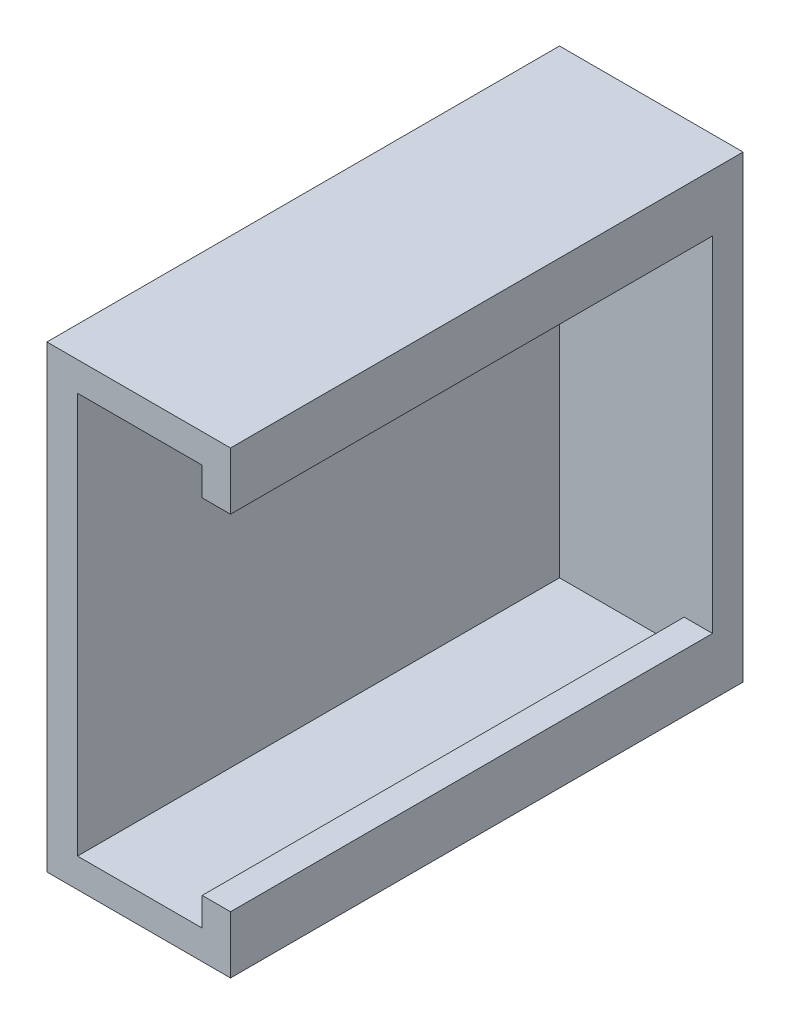
ISO-10303-21;
HEADER;
FILE_DESCRIPTION(('STEP AP214'),'2;1');
FILE_NAME('part.step','',(''),(''),'','','');
FILE_SCHEMA(('AUTOMOTIVE_DESIGN { 1 0 10303 214 1 1 1 1 }'));
ENDSEC;
DATA;
#1=APPLICATION_CONTEXT('core data for automotive mechanical design processes');
#2=APPLICATION_PROTOCOL_DEFINITION('international standard','automotive_design',2000,#1);
#3=PRODUCT_CONTEXT('',#1,'mechanical');
#4=PRODUCT('Part','Part','',(#3));
#5=PRODUCT_RELATED_PRODUCT_CATEGORY('part','',(#4));
#6=PRODUCT_DEFINITION_FORMATION('','',#4);
#7=PRODUCT_DEFINITION_CONTEXT('part definition',#1,'design');
#8=PRODUCT_DEFINITION('design','',#6,#7);
#9=PRODUCT_DEFINITION_SHAPE('','',#8);
#10=(LENGTH_UNIT() NAMED_UNIT(*) SI_UNIT(.MILLI.,.METRE.));
#11=(NAMED_UNIT(*) PLANE_ANGLE_UNIT() SI_UNIT($,.RADIAN.));
#12=(NAMED_UNIT(*) SI_UNIT($,.STERADIAN.) SOLID_ANGLE_UNIT());
#13=UNCERTAINTY_MEASURE_WITH_UNIT(LENGTH_MEASURE(1.E-05),#10,'distance_accuracy_value','');
#14=(GEOMETRIC_REPRESENTATION_CONTEXT(3) GLOBAL_UNCERTAINTY_ASSIGNED_CONTEXT((#13)) GLOBAL_UNIT_ASSIGNED_CONTEXT((#10,
#11,#12)) REPRESENTATION_CONTEXT('',''));
#15=CARTESIAN_POINT('',(0.,0.,0.));
#16=DIRECTION('',(0.,0.,1.));
#17=DIRECTION('',(1.,0.,0.));
#18=AXIS2_PLACEMENT_3D('',#15,#16,#17);
#19=CARTESIAN_POINT('',(0.,0.,4.));
#20=DIRECTION('',(0.,0.,-1.));
#21=DIRECTION('',(-1.,0.,0.));
#22=AXIS2_PLACEMENT_3D('',#19,#20,#21);
#23=PLANE('',#22);
#24=DIRECTION('',(1.,0.,0.));
#25=VECTOR('',#24,1.);
#26=CARTESIAN_POINT('',(24.,52.5,4.));
#27=LINE('',#26,#25);
#28=CARTESIAN_POINT('',(20.3,52.5,4.));
#29=VERTEX_POINT('',#28);
#30=CARTESIAN_POINT('',(24.,52.5,4.));
#31=VERTEX_POINT('',#30);
#32=EDGE_CURVE('E52',#29,#31,#27,.T.);
#33=ORIENTED_EDGE('',*,*,#32,.F.);
#34=DIRECTION('',(0.,-1.,0.));
#35=VECTOR('',#34,1.);
#36=CARTESIAN_POINT('',(20.3,52.5,4.));
#37=LINE('',#36,#35);
#38=CARTESIAN_POINT('',(20.3,56.2,4.));
#39=VERTEX_POINT('',#38);
#40=EDGE_CURVE('E56',#39,#29,#37,.T.);
#41=ORIENTED_EDGE('',*,*,#40,.F.);
#42=DIRECTION('',(1.,0.,0.));
#43=VECTOR('',#42,1.);
#44=CARTESIAN_POINT('',(20.3,56.2,4.));
#45=LINE('',#44,#43);
#46=CARTESIAN_POINT('',(4.,56.2,4.));
#47=VERTEX_POINT('',#46);
#48=EDGE_CURVE('E185',#47,#39,#45,.T.);
#49=ORIENTED_EDGE('',*,*,#48,.F.);
#50=DIRECTION('',(0.,1.,0.));
#51=VECTOR('',#50,1.);
#52=CARTESIAN_POINT('',(4.,56.2,4.));
#53=LINE('',#52,#51);
#54=CARTESIAN_POINT('',(4.00000000000001,3.8,4.));
#55=VERTEX_POINT('',#54);
#56=EDGE_CURVE('E182',#55,#47,#53,.T.);
#57=ORIENTED_EDGE('',*,*,#56,.F.);
#58=DIRECTION('',(-1.,0.,0.));
#59=VECTOR('',#58,1.);
#60=CARTESIAN_POINT('',(4.00000000000001,3.8,4.));
#61=LINE('',#60,#59);
#62=CARTESIAN_POINT('',(20.3,3.8,4.));
#63=VERTEX_POINT('',#62);
#64=EDGE_CURVE('E179',#63,#55,#61,.T.);
#65=ORIENTED_EDGE('',*,*,#64,.F.);
#66=DIRECTION('',(0.,-1.,0.));
#67=VECTOR('',#66,1.);
#68=CARTESIAN_POINT('',(20.3,3.8,4.));
#69=LINE('',#68,#67);
#70=CARTESIAN_POINT('',(20.3,7.5,4.));
#71=VERTEX_POINT('',#70);
#72=EDGE_CURVE('E176',#71,#63,#69,.T.);
#73=ORIENTED_EDGE('',*,*,#72,.F.);
#74=DIRECTION('',(-1.,0.,0.));
#75=VECTOR('',#74,1.);
#76=CARTESIAN_POINT('',(20.3,7.5,4.));
#77=LINE('',#76,#75);
#78=CARTESIAN_POINT('',(24.,7.5,4.));
#79=VERTEX_POINT('',#78);
#80=EDGE_CURVE('E173',#79,#71,#77,.T.);
#81=ORIENTED_EDGE('',*,*,#80,.F.);
#82=DIRECTION('',(0.,1.,0.));
#83=VECTOR('',#82,1.);
#84=CARTESIAN_POINT('',(24.,0.,4.));
#85=LINE('',#84,#83);
#86=EDGE_CURVE('E211',#79,#31,#85,.T.);
#87=ORIENTED_EDGE('',*,*,#86,.T.);
#88=EDGE_LOOP('',(#33,#41,#49,#57,#65,#73,#81,#87));
#89=FACE_BOUND('',#88,.T.);
#90=ADVANCED_FACE('F37',(#89),#23,.F.);
#91=CARTESIAN_POINT('',(0.,0.,4.));
#92=DIRECTION('',(1.,0.,0.));
#93=DIRECTION('',(0.,0.,-1.));
#94=AXIS2_PLACEMENT_3D('',#91,#92,#93);
#95=PLANE('',#94);
#96=DIRECTION('',(0.,-1.,0.));
#97=VECTOR('',#96,1.);
#98=CARTESIAN_POINT('',(0.,0.,0.));
#99=LINE('',#98,#97);
#100=CARTESIAN_POINT('',(0.,60.,0.));
#101=VERTEX_POINT('',#100);
#102=CARTESIAN_POINT('',(0.,0.,0.));
#103=VERTEX_POINT('',#102);
#104=EDGE_CURVE('E210',#101,#103,#99,.T.);
#105=ORIENTED_EDGE('',*,*,#104,.T.);
#106=DIRECTION('',(0.,0.,-1.));
#107=VECTOR('',#106,1.);
#108=CARTESIAN_POINT('',(0.,0.,4.));
#109=LINE('',#108,#107);
#110=CARTESIAN_POINT('',(0.,0.,67.));
#111=VERTEX_POINT('',#110);
#112=EDGE_CURVE('E11',#111,#103,#109,.T.);
#113=ORIENTED_EDGE('',*,*,#112,.F.);
#114=DIRECTION('',(0.,-1.,0.));
#115=VECTOR('',#114,1.);
#116=CARTESIAN_POINT('',(0.,0.,67.));
#117=LINE('',#116,#115);
#118=CARTESIAN_POINT('',(0.,60.,67.));
#119=VERTEX_POINT('',#118);
#120=EDGE_CURVE('E144',#119,#111,#117,.T.);
#121=ORIENTED_EDGE('',*,*,#120,.F.);
#122=DIRECTION('',(0.,0.,-1.));
#123=VECTOR('',#122,1.);
#124=CARTESIAN_POINT('',(0.,60.,4.));
#125=LINE('',#124,#123);
#126=EDGE_CURVE('E135',#119,#101,#125,.T.);
#127=ORIENTED_EDGE('',*,*,#126,.T.);
#128=EDGE_LOOP('',(#105,#113,#121,#127));
#129=FACE_BOUND('',#128,.T.);
#130=ADVANCED_FACE('F39',(#129),#95,.F.);
#131=CARTESIAN_POINT('',(0.,0.,4.));
#132=DIRECTION('',(0.,1.,0.));
#133=DIRECTION('',(0.,0.,1.));
#134=AXIS2_PLACEMENT_3D('',#131,#132,#133);
#135=PLANE('',#134);
#136=DIRECTION('',(1.,0.,0.));
#137=VECTOR('',#136,1.);
#138=CARTESIAN_POINT('',(0.,0.,0.));
#139=LINE('',#138,#137);
#140=CARTESIAN_POINT('',(24.,0.,0.));
#141=VERTEX_POINT('',#140);
#142=EDGE_CURVE('E216',#103,#141,#139,.T.);
#143=ORIENTED_EDGE('',*,*,#142,.T.);
#144=DIRECTION('',(0.,0.,-1.));
#145=VECTOR('',#144,1.);
#146=CARTESIAN_POINT('',(24.,0.,4.));
#147=LINE('',#146,#145);
#148=CARTESIAN_POINT('',(24.,0.,67.));
#149=VERTEX_POINT('',#148);
#150=EDGE_CURVE('E45',#149,#141,#147,.T.);
#151=ORIENTED_EDGE('',*,*,#150,.F.);
#152=DIRECTION('',(1.,0.,0.));
#153=VECTOR('',#152,1.);
#154=CARTESIAN_POINT('',(24.,0.,67.));
#155=LINE('',#154,#153);
#156=EDGE_CURVE('E154',#111,#149,#155,.T.);
#157=ORIENTED_EDGE('',*,*,#156,.F.);
#158=ORIENTED_EDGE('',*,*,#112,.T.);
#159=EDGE_LOOP('',(#143,#151,#157,#158));
#160=FACE_BOUND('',#159,.T.);
#161=ADVANCED_FACE('F228',(#160),#135,.F.);
#162=CARTESIAN_POINT('',(24.,0.,4.));
#163=DIRECTION('',(-1.,0.,0.));
#164=DIRECTION('',(0.,0.,1.));
#165=AXIS2_PLACEMENT_3D('',#162,#163,#164);
#166=PLANE('',#165);
#167=DIRECTION('',(0.,1.,0.));
#168=VECTOR('',#167,1.);
#169=CARTESIAN_POINT('',(24.,0.,0.));
#170=LINE('',#169,#168);
#171=CARTESIAN_POINT('',(24.,60.,0.));
#172=VERTEX_POINT('',#171);
#173=EDGE_CURVE('E132',#141,#172,#170,.T.);
#174=ORIENTED_EDGE('',*,*,#173,.T.);
#175=DIRECTION('',(0.,0.,-1.));
#176=VECTOR('',#175,1.);
#177=CARTESIAN_POINT('',(24.,60.,4.));
#178=LINE('',#177,#176);
#179=CARTESIAN_POINT('',(24.,60.,67.));
#180=VERTEX_POINT('',#179);
#181=EDGE_CURVE('E124',#180,#172,#178,.T.);
#182=ORIENTED_EDGE('',*,*,#181,.F.);
#183=DIRECTION('',(0.,1.,0.));
#184=VECTOR('',#183,1.);
#185=CARTESIAN_POINT('',(24.,60.,67.));
#186=LINE('',#185,#184);
#187=CARTESIAN_POINT('',(24.,52.5,67.));
#188=VERTEX_POINT('',#187);
#189=EDGE_CURVE('E129',#188,#180,#186,.T.);
#190=ORIENTED_EDGE('',*,*,#189,.F.);
#191=DIRECTION('',(0.,0.,-1.));
#192=VECTOR('',#191,1.);
#193=CARTESIAN_POINT('',(24.,52.5,67.));
#194=LINE('',#193,#192);
#195=EDGE_CURVE('E172',#188,#31,#194,.T.);
#196=ORIENTED_EDGE('',*,*,#195,.T.);
#197=ORIENTED_EDGE('',*,*,#86,.F.);
#198=DIRECTION('',(0.,0.,-1.));
#199=VECTOR('',#198,1.);
#200=CARTESIAN_POINT('',(24.,7.5,67.));
#201=LINE('',#200,#199);
#202=CARTESIAN_POINT('',(24.,7.5,67.));
#203=VERTEX_POINT('',#202);
#204=EDGE_CURVE('E207',#203,#79,#201,.T.);
#205=ORIENTED_EDGE('',*,*,#204,.F.);
#206=DIRECTION('',(0.,1.,0.));
#207=VECTOR('',#206,1.);
#208=CARTESIAN_POINT('',(24.,7.5,67.));
#209=LINE('',#208,#207);
#210=EDGE_CURVE('E157',#149,#203,#209,.T.);
#211=ORIENTED_EDGE('',*,*,#210,.F.);
#212=ORIENTED_EDGE('',*,*,#150,.T.);
#213=EDGE_LOOP('',(#174,#182,#190,#196,#197,#205,#211,#212));
#214=FACE_BOUND('',#213,.T.);
#215=ADVANCED_FACE('F126',(#214),#166,.F.);
#216=CARTESIAN_POINT('',(0.,60.,4.));
#217=DIRECTION('',(0.,-1.,0.));
#218=DIRECTION('',(0.,0.,-1.));
#219=AXIS2_PLACEMENT_3D('',#216,#217,#218);
#220=PLANE('',#219);
#221=DIRECTION('',(-1.,0.,0.));
#222=VECTOR('',#221,1.);
#223=CARTESIAN_POINT('',(0.,60.,0.));
#224=LINE('',#223,#222);
#225=EDGE_CURVE('E213',#172,#101,#224,.T.);
#226=ORIENTED_EDGE('',*,*,#225,.T.);
#227=ORIENTED_EDGE('',*,*,#126,.F.);
#228=DIRECTION('',(-1.,0.,0.));
#229=VECTOR('',#228,1.);
#230=CARTESIAN_POINT('',(0.,60.,67.));
#231=LINE('',#230,#229);
#232=EDGE_CURVE('E138',#180,#119,#231,.T.);
#233=ORIENTED_EDGE('',*,*,#232,.F.);
#234=ORIENTED_EDGE('',*,*,#181,.T.);
#235=EDGE_LOOP('',(#226,#227,#233,#234));
#236=FACE_BOUND('',#235,.T.);
#237=ADVANCED_FACE('F139',(#236),#220,.F.);
#238=CARTESIAN_POINT('',(0.,0.,0.));
#239=DIRECTION('',(0.,0.,-1.));
#240=DIRECTION('',(-1.,0.,0.));
#241=AXIS2_PLACEMENT_3D('',#238,#239,#240);
#242=PLANE('',#241);
#243=ORIENTED_EDGE('',*,*,#104,.F.);
#244=ORIENTED_EDGE('',*,*,#225,.F.);
#245=ORIENTED_EDGE('',*,*,#173,.F.);
#246=ORIENTED_EDGE('',*,*,#142,.F.);
#247=EDGE_LOOP('',(#243,#244,#245,#246));
#248=FACE_BOUND('',#247,.T.);
#249=ADVANCED_FACE('F226',(#248),#242,.T.);
#250=CARTESIAN_POINT('',(20.3,7.5,67.));
#251=DIRECTION('',(0.,-1.,0.));
#252=DIRECTION('',(0.,0.,-1.));
#253=AXIS2_PLACEMENT_3D('',#250,#251,#252);
#254=PLANE('',#253);
#255=ORIENTED_EDGE('',*,*,#80,.T.);
#256=DIRECTION('',(0.,0.,-1.));
#257=VECTOR('',#256,1.);
#258=CARTESIAN_POINT('',(20.3,7.5,67.));
#259=LINE('',#258,#257);
#260=CARTESIAN_POINT('',(20.3,7.5,67.));
#261=VERTEX_POINT('',#260);
#262=EDGE_CURVE('E204',#261,#71,#259,.T.);
#263=ORIENTED_EDGE('',*,*,#262,.F.);
#264=DIRECTION('',(-1.,0.,0.));
#265=VECTOR('',#264,1.);
#266=CARTESIAN_POINT('',(20.3,7.5,67.));
#267=LINE('',#266,#265);
#268=EDGE_CURVE('E159',#203,#261,#267,.T.);
#269=ORIENTED_EDGE('',*,*,#268,.F.);
#270=ORIENTED_EDGE('',*,*,#204,.T.);
#271=EDGE_LOOP('',(#255,#263,#269,#270));
#272=FACE_BOUND('',#271,.T.);
#273=ADVANCED_FACE('F241',(#272),#254,.F.);
#274=CARTESIAN_POINT('',(20.3,3.8,67.));
#275=DIRECTION('',(1.,0.,0.));
#276=DIRECTION('',(0.,0.,-1.));
#277=AXIS2_PLACEMENT_3D('',#274,#275,#276);
#278=PLANE('',#277);
#279=ORIENTED_EDGE('',*,*,#72,.T.);
#280=DIRECTION('',(0.,0.,-1.));
#281=VECTOR('',#280,1.);
#282=CARTESIAN_POINT('',(20.3,3.8,67.));
#283=LINE('',#282,#281);
#284=CARTESIAN_POINT('',(20.3,3.8,67.));
#285=VERTEX_POINT('',#284);
#286=EDGE_CURVE('E201',#285,#63,#283,.T.);
#287=ORIENTED_EDGE('',*,*,#286,.F.);
#288=DIRECTION('',(0.,-1.,0.));
#289=VECTOR('',#288,1.);
#290=CARTESIAN_POINT('',(20.3,3.8,67.));
#291=LINE('',#290,#289);
#292=EDGE_CURVE('E161',#261,#285,#291,.T.);
#293=ORIENTED_EDGE('',*,*,#292,.F.);
#294=ORIENTED_EDGE('',*,*,#262,.T.);
#295=EDGE_LOOP('',(#279,#287,#293,#294));
#296=FACE_BOUND('',#295,.T.);
#297=ADVANCED_FACE('F260',(#296),#278,.F.);
#298=CARTESIAN_POINT('',(4.00000000000001,3.8,67.));
#299=DIRECTION('',(0.,-1.,0.));
#300=DIRECTION('',(0.,0.,-1.));
#301=AXIS2_PLACEMENT_3D('',#298,#299,#300);
#302=PLANE('',#301);
#303=ORIENTED_EDGE('',*,*,#64,.T.);
#304=DIRECTION('',(0.,0.,-1.));
#305=VECTOR('',#304,1.);
#306=CARTESIAN_POINT('',(4.00000000000001,3.8,67.));
#307=LINE('',#306,#305);
#308=CARTESIAN_POINT('',(4.00000000000001,3.8,67.));
#309=VERTEX_POINT('',#308);
#310=EDGE_CURVE('E198',#309,#55,#307,.T.);
#311=ORIENTED_EDGE('',*,*,#310,.F.);
#312=DIRECTION('',(-1.,0.,0.));
#313=VECTOR('',#312,1.);
#314=CARTESIAN_POINT('',(4.00000000000001,3.8,67.));
#315=LINE('',#314,#313);
#316=EDGE_CURVE('E163',#285,#309,#315,.T.);
#317=ORIENTED_EDGE('',*,*,#316,.F.);
#318=ORIENTED_EDGE('',*,*,#286,.T.);
#319=EDGE_LOOP('',(#303,#311,#317,#318));
#320=FACE_BOUND('',#319,.T.);
#321=ADVANCED_FACE('F267',(#320),#302,.F.);
#322=CARTESIAN_POINT('',(4.,56.2,67.));
#323=DIRECTION('',(-1.,0.,0.));
#324=DIRECTION('',(0.,-1.,0.));
#325=AXIS2_PLACEMENT_3D('',#322,#323,#324);
#326=PLANE('',#325);
#327=ORIENTED_EDGE('',*,*,#56,.T.);
#328=DIRECTION('',(0.,0.,-1.));
#329=VECTOR('',#328,1.);
#330=CARTESIAN_POINT('',(4.,56.2,67.));
#331=LINE('',#330,#329);
#332=CARTESIAN_POINT('',(4.,56.2,67.));
#333=VERTEX_POINT('',#332);
#334=EDGE_CURVE('E195',#333,#47,#331,.T.);
#335=ORIENTED_EDGE('',*,*,#334,.F.);
#336=DIRECTION('',(0.,1.,0.));
#337=VECTOR('',#336,1.);
#338=CARTESIAN_POINT('',(4.,56.2,67.));
#339=LINE('',#338,#337);
#340=EDGE_CURVE('E165',#309,#333,#339,.T.);
#341=ORIENTED_EDGE('',*,*,#340,.F.);
#342=ORIENTED_EDGE('',*,*,#310,.T.);
#343=EDGE_LOOP('',(#327,#335,#341,#342));
#344=FACE_BOUND('',#343,.T.);
#345=ADVANCED_FACE('F274',(#344),#326,.F.);
#346=CARTESIAN_POINT('',(20.3,56.2,67.));
#347=DIRECTION('',(0.,1.,0.));
#348=DIRECTION('',(0.,0.,1.));
#349=AXIS2_PLACEMENT_3D('',#346,#347,#348);
#350=PLANE('',#349);
#351=ORIENTED_EDGE('',*,*,#48,.T.);
#352=DIRECTION('',(0.,0.,-1.));
#353=VECTOR('',#352,1.);
#354=CARTESIAN_POINT('',(20.3,56.2,67.));
#355=LINE('',#354,#353);
#356=CARTESIAN_POINT('',(20.3,56.2,67.));
#357=VERTEX_POINT('',#356);
#358=EDGE_CURVE('E192',#357,#39,#355,.T.);
#359=ORIENTED_EDGE('',*,*,#358,.F.);
#360=DIRECTION('',(1.,0.,0.));
#361=VECTOR('',#360,1.);
#362=CARTESIAN_POINT('',(20.3,56.2,67.));
#363=LINE('',#362,#361);
#364=EDGE_CURVE('E167',#333,#357,#363,.T.);
#365=ORIENTED_EDGE('',*,*,#364,.F.);
#366=ORIENTED_EDGE('',*,*,#334,.T.);
#367=EDGE_LOOP('',(#351,#359,#365,#366));
#368=FACE_BOUND('',#367,.T.);
#369=ADVANCED_FACE('F282',(#368),#350,.F.);
#370=CARTESIAN_POINT('',(20.3,52.5,67.));
#371=DIRECTION('',(1.,0.,0.));
#372=DIRECTION('',(0.,0.,-1.));
#373=AXIS2_PLACEMENT_3D('',#370,#371,#372);
#374=PLANE('',#373);
#375=ORIENTED_EDGE('',*,*,#40,.T.);
#376=DIRECTION('',(0.,0.,-1.));
#377=VECTOR('',#376,1.);
#378=CARTESIAN_POINT('',(20.3,52.5,67.));
#379=LINE('',#378,#377);
#380=CARTESIAN_POINT('',(20.3,52.5,67.));
#381=VERTEX_POINT('',#380);
#382=EDGE_CURVE('E189',#381,#29,#379,.T.);
#383=ORIENTED_EDGE('',*,*,#382,.F.);
#384=DIRECTION('',(0.,-1.,0.));
#385=VECTOR('',#384,1.);
#386=CARTESIAN_POINT('',(20.3,52.5,67.));
#387=LINE('',#386,#385);
#388=EDGE_CURVE('E169',#357,#381,#387,.T.);
#389=ORIENTED_EDGE('',*,*,#388,.F.);
#390=ORIENTED_EDGE('',*,*,#358,.T.);
#391=EDGE_LOOP('',(#375,#383,#389,#390));
#392=FACE_BOUND('',#391,.T.);
#393=ADVANCED_FACE('F290',(#392),#374,.F.);
#394=CARTESIAN_POINT('',(24.,52.5,67.));
#395=DIRECTION('',(0.,1.,0.));
#396=DIRECTION('',(0.,0.,1.));
#397=AXIS2_PLACEMENT_3D('',#394,#395,#396);
#398=PLANE('',#397);
#399=ORIENTED_EDGE('',*,*,#32,.T.);
#400=ORIENTED_EDGE('',*,*,#195,.F.);
#401=DIRECTION('',(1.,0.,0.));
#402=VECTOR('',#401,1.);
#403=CARTESIAN_POINT('',(24.,52.5,67.));
#404=LINE('',#403,#402);
#405=EDGE_CURVE('E148',#381,#188,#404,.T.);
#406=ORIENTED_EDGE('',*,*,#405,.F.);
#407=ORIENTED_EDGE('',*,*,#382,.T.);
#408=EDGE_LOOP('',(#399,#400,#406,#407));
#409=FACE_BOUND('',#408,.T.);
#410=ADVANCED_FACE('F298',(#409),#398,.F.);
#411=CARTESIAN_POINT('',(0.,0.,67.));
#412=DIRECTION('',(0.,0.,-1.));
#413=DIRECTION('',(-1.,0.,0.));
#414=AXIS2_PLACEMENT_3D('',#411,#412,#413);
#415=PLANE('',#414);
#416=ORIENTED_EDGE('',*,*,#189,.T.);
#417=ORIENTED_EDGE('',*,*,#232,.T.);
#418=ORIENTED_EDGE('',*,*,#120,.T.);
#419=ORIENTED_EDGE('',*,*,#156,.T.);
#420=ORIENTED_EDGE('',*,*,#210,.T.);
#421=ORIENTED_EDGE('',*,*,#268,.T.);
#422=ORIENTED_EDGE('',*,*,#292,.T.);
#423=ORIENTED_EDGE('',*,*,#316,.T.);
#424=ORIENTED_EDGE('',*,*,#340,.T.);
#425=ORIENTED_EDGE('',*,*,#364,.T.);
#426=ORIENTED_EDGE('',*,*,#388,.T.);
#427=ORIENTED_EDGE('',*,*,#405,.T.);
#428=EDGE_LOOP('',(#416,#417,#418,#419,#420,#421,#422,#423,#424,#425,#426,#427));
#429=FACE_BOUND('',#428,.T.);
#430=ADVANCED_FACE('F146',(#429),#415,.F.);
#431=CLOSED_SHELL('',(#90,#130,#161,#215,#237,#249,#273,#297,#321,#345,#369,#393,#410,#430));
#432=MANIFOLD_SOLID_BREP('B2',#431);
#433=ADVANCED_BREP_SHAPE_REPRESENTATION('',(#18,#432),#14);
#434=SHAPE_DEFINITION_REPRESENTATION(#9,#433);
ENDSEC;
END-ISO-10303-21;
